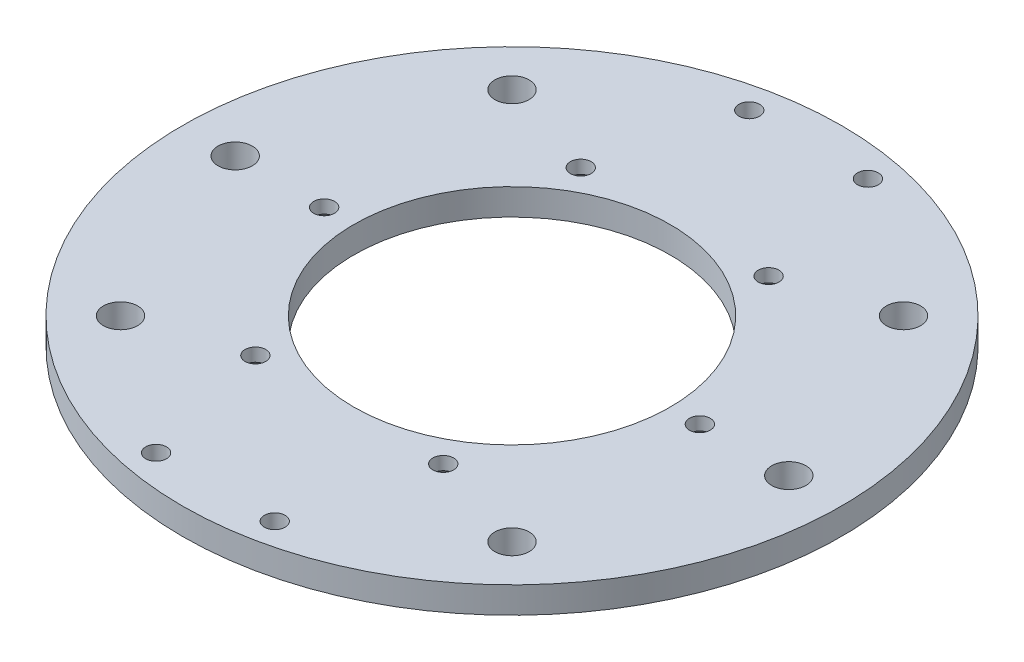
ISO-10303-21;
HEADER;
FILE_DESCRIPTION(('STEP AP214'),'2;1');
FILE_NAME('part.step','',(''),(''),'','','');
FILE_SCHEMA(('AUTOMOTIVE_DESIGN { 1 0 10303 214 1 1 1 1 }'));
ENDSEC;
DATA;
#1=APPLICATION_CONTEXT('core data for automotive mechanical design processes');
#2=APPLICATION_PROTOCOL_DEFINITION('international standard','automotive_design',2000,#1);
#3=PRODUCT_CONTEXT('',#1,'mechanical');
#4=PRODUCT('Part','Part','',(#3));
#5=PRODUCT_RELATED_PRODUCT_CATEGORY('part','',(#4));
#6=PRODUCT_DEFINITION_FORMATION('','',#4);
#7=PRODUCT_DEFINITION_CONTEXT('part definition',#1,'design');
#8=PRODUCT_DEFINITION('design','',#6,#7);
#9=PRODUCT_DEFINITION_SHAPE('','',#8);
#10=(LENGTH_UNIT() NAMED_UNIT(*) SI_UNIT(.MILLI.,.METRE.));
#11=(NAMED_UNIT(*) PLANE_ANGLE_UNIT() SI_UNIT($,.RADIAN.));
#12=(NAMED_UNIT(*) SI_UNIT($,.STERADIAN.) SOLID_ANGLE_UNIT());
#13=UNCERTAINTY_MEASURE_WITH_UNIT(LENGTH_MEASURE(1.E-05),#10,'distance_accuracy_value','');
#14=(GEOMETRIC_REPRESENTATION_CONTEXT(3) GLOBAL_UNCERTAINTY_ASSIGNED_CONTEXT((#13)) GLOBAL_UNIT_ASSIGNED_CONTEXT((#10,
#11,#12)) REPRESENTATION_CONTEXT('',''));
#15=CARTESIAN_POINT('',(0.,0.,0.));
#16=DIRECTION('',(0.,0.,1.));
#17=DIRECTION('',(1.,0.,0.));
#18=AXIS2_PLACEMENT_3D('',#15,#16,#17);
#19=CARTESIAN_POINT('',(0.,4.,0.));
#20=DIRECTION('',(0.,1.,0.));
#21=DIRECTION('',(0.,0.,1.));
#22=AXIS2_PLACEMENT_3D('',#19,#20,#21);
#23=PLANE('',#22);
#24=CARTESIAN_POINT('',(29.6984848098349,4.,-29.6984848098351));
#25=DIRECTION('',(0.,-1.,0.));
#26=DIRECTION('',(0.,0.,-1.));
#27=AXIS2_PLACEMENT_3D('',#24,#25,#26);
#28=CIRCLE('',#27,2.59999999999999);
#29=CARTESIAN_POINT('',(29.6984848098349,4.,-32.298484809835));
#30=VERTEX_POINT('',#29);
#31=EDGE_CURVE('E143',#30,#30,#28,.T.);
#32=ORIENTED_EDGE('',*,*,#31,.T.);
#33=EDGE_LOOP('',(#32));
#34=FACE_BOUND('',#33,.T.);
#35=CARTESIAN_POINT('',(-42.,4.,0.));
#36=DIRECTION('',(0.,-1.,0.));
#37=DIRECTION('',(0.,0.,-1.));
#38=AXIS2_PLACEMENT_3D('',#35,#36,#37);
#39=CIRCLE('',#38,2.59999999999998);
#40=CARTESIAN_POINT('',(-42.,4.,-2.59999999999998));
#41=VERTEX_POINT('',#40);
#42=EDGE_CURVE('E137',#41,#41,#39,.T.);
#43=ORIENTED_EDGE('',*,*,#42,.T.);
#44=EDGE_LOOP('',(#43));
#45=FACE_BOUND('',#44,.T.);
#46=CARTESIAN_POINT('',(42.,4.,0.));
#47=DIRECTION('',(0.,-1.,0.));
#48=DIRECTION('',(0.,0.,-1.));
#49=AXIS2_PLACEMENT_3D('',#46,#47,#48);
#50=CIRCLE('',#49,2.59999999999998);
#51=CARTESIAN_POINT('',(42.,4.,-2.59999999999998));
#52=VERTEX_POINT('',#51);
#53=EDGE_CURVE('E131',#52,#52,#50,.T.);
#54=ORIENTED_EDGE('',*,*,#53,.T.);
#55=EDGE_LOOP('',(#54));
#56=FACE_BOUND('',#55,.T.);
#57=CARTESIAN_POINT('',(-9.00000000000001,4.,-45.));
#58=DIRECTION('',(0.,-1.,0.));
#59=DIRECTION('',(0.,0.,-1.));
#60=AXIS2_PLACEMENT_3D('',#57,#58,#59);
#61=CIRCLE('',#60,1.575);
#62=CARTESIAN_POINT('',(-9.00000000000001,4.,-46.575));
#63=VERTEX_POINT('',#62);
#64=EDGE_CURVE('E125',#63,#63,#61,.T.);
#65=ORIENTED_EDGE('',*,*,#64,.T.);
#66=EDGE_LOOP('',(#65));
#67=FACE_BOUND('',#66,.T.);
#68=CARTESIAN_POINT('',(-9.00000000000001,4.,45.));
#69=DIRECTION('',(0.,-1.,0.));
#70=DIRECTION('',(0.,0.,-1.));
#71=AXIS2_PLACEMENT_3D('',#68,#69,#70);
#72=CIRCLE('',#71,1.575);
#73=CARTESIAN_POINT('',(-9.00000000000001,4.,43.425));
#74=VERTEX_POINT('',#73);
#75=EDGE_CURVE('E119',#74,#74,#72,.T.);
#76=ORIENTED_EDGE('',*,*,#75,.T.);
#77=EDGE_LOOP('',(#76));
#78=FACE_BOUND('',#77,.T.);
#79=CARTESIAN_POINT('',(8.99999999999999,4.,-45.));
#80=DIRECTION('',(0.,-1.,0.));
#81=DIRECTION('',(0.,0.,-1.));
#82=AXIS2_PLACEMENT_3D('',#79,#80,#81);
#83=CIRCLE('',#82,1.575);
#84=CARTESIAN_POINT('',(8.99999999999999,4.,-46.575));
#85=VERTEX_POINT('',#84);
#86=EDGE_CURVE('E113',#85,#85,#83,.T.);
#87=ORIENTED_EDGE('',*,*,#86,.T.);
#88=EDGE_LOOP('',(#87));
#89=FACE_BOUND('',#88,.T.);
#90=CARTESIAN_POINT('',(8.99999999999999,4.,45.));
#91=DIRECTION('',(0.,-1.,0.));
#92=DIRECTION('',(0.,0.,-1.));
#93=AXIS2_PLACEMENT_3D('',#90,#91,#92);
#94=CIRCLE('',#93,1.575);
#95=CARTESIAN_POINT('',(8.99999999999999,4.,43.425));
#96=VERTEX_POINT('',#95);
#97=EDGE_CURVE('E107',#96,#96,#94,.T.);
#98=ORIENTED_EDGE('',*,*,#97,.T.);
#99=EDGE_LOOP('',(#98));
#100=FACE_BOUND('',#99,.T.);
#101=CARTESIAN_POINT('',(14.2500000000003,4.,24.6817240078563));
#102=DIRECTION('',(0.,1.,0.));
#103=DIRECTION('',(0.,0.,1.));
#104=AXIS2_PLACEMENT_3D('',#101,#102,#103);
#105=CIRCLE('',#104,1.57499999999999);
#106=CARTESIAN_POINT('',(14.2500000000003,4.,26.2567240078563));
#107=VERTEX_POINT('',#106);
#108=EDGE_CURVE('E104',#107,#107,#105,.T.);
#109=ORIENTED_EDGE('',*,*,#108,.F.);
#110=EDGE_LOOP('',(#109));
#111=FACE_BOUND('',#110,.T.);
#112=CARTESIAN_POINT('',(-14.2499999999998,4.,24.6817240078566));
#113=DIRECTION('',(0.,1.,0.));
#114=DIRECTION('',(0.,0.,1.));
#115=AXIS2_PLACEMENT_3D('',#112,#113,#114);
#116=CIRCLE('',#115,1.57499999999999);
#117=CARTESIAN_POINT('',(-14.2499999999998,4.,26.2567240078566));
#118=VERTEX_POINT('',#117);
#119=EDGE_CURVE('E101',#118,#118,#116,.T.);
#120=ORIENTED_EDGE('',*,*,#119,.F.);
#121=EDGE_LOOP('',(#120));
#122=FACE_BOUND('',#121,.T.);
#123=CARTESIAN_POINT('',(-28.5,4.,0.));
#124=DIRECTION('',(0.,1.,0.));
#125=DIRECTION('',(0.,0.,1.));
#126=AXIS2_PLACEMENT_3D('',#123,#124,#125);
#127=CIRCLE('',#126,1.57499999999999);
#128=CARTESIAN_POINT('',(-28.5,4.,1.57499999999999));
#129=VERTEX_POINT('',#128);
#130=EDGE_CURVE('E98',#129,#129,#127,.T.);
#131=ORIENTED_EDGE('',*,*,#130,.F.);
#132=EDGE_LOOP('',(#131));
#133=FACE_BOUND('',#132,.T.);
#134=CARTESIAN_POINT('',(-14.2500000000001,4.,-24.6817240078564));
#135=DIRECTION('',(0.,1.,0.));
#136=DIRECTION('',(0.,0.,1.));
#137=AXIS2_PLACEMENT_3D('',#134,#135,#136);
#138=CIRCLE('',#137,1.57499999999999);
#139=CARTESIAN_POINT('',(-14.2500000000001,4.,-23.1067240078564));
#140=VERTEX_POINT('',#139);
#141=EDGE_CURVE('E95',#140,#140,#138,.T.);
#142=ORIENTED_EDGE('',*,*,#141,.F.);
#143=EDGE_LOOP('',(#142));
#144=FACE_BOUND('',#143,.T.);
#145=CARTESIAN_POINT('',(14.2499999999999,4.,-24.6817240078565));
#146=DIRECTION('',(0.,1.,0.));
#147=DIRECTION('',(0.,0.,1.));
#148=AXIS2_PLACEMENT_3D('',#145,#146,#147);
#149=CIRCLE('',#148,1.57499999999999);
#150=CARTESIAN_POINT('',(14.2499999999999,4.,-23.1067240078565));
#151=VERTEX_POINT('',#150);
#152=EDGE_CURVE('E92',#151,#151,#149,.T.);
#153=ORIENTED_EDGE('',*,*,#152,.F.);
#154=EDGE_LOOP('',(#153));
#155=FACE_BOUND('',#154,.T.);
#156=CARTESIAN_POINT('',(28.5,4.,0.));
#157=DIRECTION('',(0.,1.,0.));
#158=DIRECTION('',(0.,0.,1.));
#159=AXIS2_PLACEMENT_3D('',#156,#157,#158);
#160=CIRCLE('',#159,1.57499999999999);
#161=CARTESIAN_POINT('',(28.5,4.,1.57499999999999));
#162=VERTEX_POINT('',#161);
#163=EDGE_CURVE('E87',#162,#162,#160,.T.);
#164=ORIENTED_EDGE('',*,*,#163,.F.);
#165=EDGE_LOOP('',(#164));
#166=FACE_BOUND('',#165,.T.);
#167=CARTESIAN_POINT('',(0.,4.,0.));
#168=DIRECTION('',(0.,1.,0.));
#169=DIRECTION('',(0.,0.,1.));
#170=AXIS2_PLACEMENT_3D('',#167,#168,#169);
#171=CIRCLE('',#170,50.);
#172=CARTESIAN_POINT('',(0.,4.,50.));
#173=VERTEX_POINT('',#172);
#174=EDGE_CURVE('E77',#173,#173,#171,.T.);
#175=ORIENTED_EDGE('',*,*,#174,.T.);
#176=EDGE_LOOP('',(#175));
#177=FACE_BOUND('',#176,.T.);
#178=CARTESIAN_POINT('',(0.,4.,0.));
#179=DIRECTION('',(0.,1.,0.));
#180=DIRECTION('',(0.,0.,1.));
#181=AXIS2_PLACEMENT_3D('',#178,#179,#180);
#182=CIRCLE('',#181,24.);
#183=CARTESIAN_POINT('',(0.,4.,24.));
#184=VERTEX_POINT('',#183);
#185=EDGE_CURVE('E81',#184,#184,#182,.T.);
#186=ORIENTED_EDGE('',*,*,#185,.F.);
#187=EDGE_LOOP('',(#186));
#188=FACE_BOUND('',#187,.T.);
#189=CARTESIAN_POINT('',(-29.6984848098349,4.,29.6984848098351));
#190=DIRECTION('',(0.,-1.,0.));
#191=DIRECTION('',(0.,0.,-1.));
#192=AXIS2_PLACEMENT_3D('',#189,#190,#191);
#193=CIRCLE('',#192,2.59999999999999);
#194=CARTESIAN_POINT('',(-29.6984848098349,4.,27.0984848098351));
#195=VERTEX_POINT('',#194);
#196=EDGE_CURVE('E149',#195,#195,#193,.T.);
#197=ORIENTED_EDGE('',*,*,#196,.T.);
#198=EDGE_LOOP('',(#197));
#199=FACE_BOUND('',#198,.T.);
#200=CARTESIAN_POINT('',(29.6984848098349,4.,29.6984848098351));
#201=DIRECTION('',(0.,-1.,0.));
#202=DIRECTION('',(0.,0.,-1.));
#203=AXIS2_PLACEMENT_3D('',#200,#201,#202);
#204=CIRCLE('',#203,2.59999999999999);
#205=CARTESIAN_POINT('',(29.6984848098349,4.,27.0984848098351));
#206=VERTEX_POINT('',#205);
#207=EDGE_CURVE('E155',#206,#206,#204,.T.);
#208=ORIENTED_EDGE('',*,*,#207,.T.);
#209=EDGE_LOOP('',(#208));
#210=FACE_BOUND('',#209,.T.);
#211=CARTESIAN_POINT('',(-29.6984848098349,4.,-29.6984848098351));
#212=DIRECTION('',(0.,-1.,0.));
#213=DIRECTION('',(0.,0.,-1.));
#214=AXIS2_PLACEMENT_3D('',#211,#212,#213);
#215=CIRCLE('',#214,2.59999999999999);
#216=CARTESIAN_POINT('',(-29.6984848098349,4.,-32.298484809835));
#217=VERTEX_POINT('',#216);
#218=EDGE_CURVE('E161',#217,#217,#215,.T.);
#219=ORIENTED_EDGE('',*,*,#218,.T.);
#220=EDGE_LOOP('',(#219));
#221=FACE_BOUND('',#220,.T.);
#222=ADVANCED_FACE('F33',(#34,#45,#56,#67,#78,#89,#100,#111,#122,#133,#144,#155,#166,#177,#188,
#199,#210,#221),#23,.T.);
#223=CARTESIAN_POINT('',(0.,0.,0.));
#224=DIRECTION('',(0.,1.,0.));
#225=DIRECTION('',(0.,0.,1.));
#226=AXIS2_PLACEMENT_3D('',#223,#224,#225);
#227=PLANE('',#226);
#228=CARTESIAN_POINT('',(-29.6984848098349,0.,-29.6984848098351));
#229=DIRECTION('',(0.,-1.,0.));
#230=DIRECTION('',(0.,0.,-1.));
#231=AXIS2_PLACEMENT_3D('',#228,#229,#230);
#232=CIRCLE('',#231,2.59999999999999);
#233=CARTESIAN_POINT('',(-29.6984848098349,0.,-32.298484809835));
#234=VERTEX_POINT('',#233);
#235=EDGE_CURVE('E164',#234,#234,#232,.T.);
#236=ORIENTED_EDGE('',*,*,#235,.F.);
#237=EDGE_LOOP('',(#236));
#238=FACE_BOUND('',#237,.T.);
#239=CARTESIAN_POINT('',(-29.6984848098349,0.,29.6984848098351));
#240=DIRECTION('',(0.,-1.,0.));
#241=DIRECTION('',(0.,0.,-1.));
#242=AXIS2_PLACEMENT_3D('',#239,#240,#241);
#243=CIRCLE('',#242,2.59999999999999);
#244=CARTESIAN_POINT('',(-29.6984848098349,0.,27.0984848098351));
#245=VERTEX_POINT('',#244);
#246=EDGE_CURVE('E152',#245,#245,#243,.T.);
#247=ORIENTED_EDGE('',*,*,#246,.F.);
#248=EDGE_LOOP('',(#247));
#249=FACE_BOUND('',#248,.T.);
#250=CARTESIAN_POINT('',(-42.,0.,0.));
#251=DIRECTION('',(0.,-1.,0.));
#252=DIRECTION('',(0.,0.,-1.));
#253=AXIS2_PLACEMENT_3D('',#250,#251,#252);
#254=CIRCLE('',#253,2.59999999999998);
#255=CARTESIAN_POINT('',(-42.,0.,-2.59999999999998));
#256=VERTEX_POINT('',#255);
#257=EDGE_CURVE('E140',#256,#256,#254,.T.);
#258=ORIENTED_EDGE('',*,*,#257,.F.);
#259=EDGE_LOOP('',(#258));
#260=FACE_BOUND('',#259,.T.);
#261=CARTESIAN_POINT('',(42.,0.,0.));
#262=DIRECTION('',(0.,-1.,0.));
#263=DIRECTION('',(0.,0.,-1.));
#264=AXIS2_PLACEMENT_3D('',#261,#262,#263);
#265=CIRCLE('',#264,2.59999999999998);
#266=CARTESIAN_POINT('',(42.,0.,-2.59999999999998));
#267=VERTEX_POINT('',#266);
#268=EDGE_CURVE('E134',#267,#267,#265,.T.);
#269=ORIENTED_EDGE('',*,*,#268,.F.);
#270=EDGE_LOOP('',(#269));
#271=FACE_BOUND('',#270,.T.);
#272=CARTESIAN_POINT('',(-9.00000000000001,0.,-45.));
#273=DIRECTION('',(0.,-1.,0.));
#274=DIRECTION('',(0.,0.,-1.));
#275=AXIS2_PLACEMENT_3D('',#272,#273,#274);
#276=CIRCLE('',#275,1.57499999999999);
#277=CARTESIAN_POINT('',(-9.00000000000001,0.,-46.575));
#278=VERTEX_POINT('',#277);
#279=EDGE_CURVE('E128',#278,#278,#276,.T.);
#280=ORIENTED_EDGE('',*,*,#279,.F.);
#281=EDGE_LOOP('',(#280));
#282=FACE_BOUND('',#281,.T.);
#283=CARTESIAN_POINT('',(-9.00000000000001,0.,45.));
#284=DIRECTION('',(0.,-1.,0.));
#285=DIRECTION('',(0.,0.,-1.));
#286=AXIS2_PLACEMENT_3D('',#283,#284,#285);
#287=CIRCLE('',#286,1.57499999999999);
#288=CARTESIAN_POINT('',(-9.00000000000001,0.,43.425));
#289=VERTEX_POINT('',#288);
#290=EDGE_CURVE('E122',#289,#289,#287,.T.);
#291=ORIENTED_EDGE('',*,*,#290,.F.);
#292=EDGE_LOOP('',(#291));
#293=FACE_BOUND('',#292,.T.);
#294=CARTESIAN_POINT('',(8.99999999999999,0.,-45.));
#295=DIRECTION('',(0.,-1.,0.));
#296=DIRECTION('',(0.,0.,-1.));
#297=AXIS2_PLACEMENT_3D('',#294,#295,#296);
#298=CIRCLE('',#297,1.57499999999999);
#299=CARTESIAN_POINT('',(8.99999999999999,0.,-46.575));
#300=VERTEX_POINT('',#299);
#301=EDGE_CURVE('E116',#300,#300,#298,.T.);
#302=ORIENTED_EDGE('',*,*,#301,.F.);
#303=EDGE_LOOP('',(#302));
#304=FACE_BOUND('',#303,.T.);
#305=CARTESIAN_POINT('',(8.99999999999999,0.,45.));
#306=DIRECTION('',(0.,-1.,0.));
#307=DIRECTION('',(0.,0.,-1.));
#308=AXIS2_PLACEMENT_3D('',#305,#306,#307);
#309=CIRCLE('',#308,1.57499999999999);
#310=CARTESIAN_POINT('',(8.99999999999999,0.,43.425));
#311=VERTEX_POINT('',#310);
#312=EDGE_CURVE('E110',#311,#311,#309,.T.);
#313=ORIENTED_EDGE('',*,*,#312,.F.);
#314=EDGE_LOOP('',(#313));
#315=FACE_BOUND('',#314,.T.);
#316=CARTESIAN_POINT('',(-14.2499999999998,0.,24.6817240078566));
#317=DIRECTION('',(0.,1.,0.));
#318=DIRECTION('',(0.,0.,1.));
#319=AXIS2_PLACEMENT_3D('',#316,#317,#318);
#320=CIRCLE('',#319,3.57499999999998);
#321=CARTESIAN_POINT('',(-14.2499999999998,0.,28.2567240078566));
#322=VERTEX_POINT('',#321);
#323=EDGE_CURVE('E59',#322,#322,#320,.T.);
#324=ORIENTED_EDGE('',*,*,#323,.T.);
#325=EDGE_LOOP('',(#324));
#326=FACE_BOUND('',#325,.T.);
#327=CARTESIAN_POINT('',(-28.5,0.,0.));
#328=DIRECTION('',(0.,1.,0.));
#329=DIRECTION('',(0.,0.,1.));
#330=AXIS2_PLACEMENT_3D('',#327,#328,#329);
#331=CIRCLE('',#330,3.57499999999998);
#332=CARTESIAN_POINT('',(-28.5,0.,3.57499999999998));
#333=VERTEX_POINT('',#332);
#334=EDGE_CURVE('E62',#333,#333,#331,.T.);
#335=ORIENTED_EDGE('',*,*,#334,.T.);
#336=EDGE_LOOP('',(#335));
#337=FACE_BOUND('',#336,.T.);
#338=CARTESIAN_POINT('',(-14.2500000000001,0.,-24.6817240078564));
#339=DIRECTION('',(0.,1.,0.));
#340=DIRECTION('',(0.,0.,1.));
#341=AXIS2_PLACEMENT_3D('',#338,#339,#340);
#342=CIRCLE('',#341,3.57499999999998);
#343=CARTESIAN_POINT('',(-14.2500000000001,0.,-21.1067240078565));
#344=VERTEX_POINT('',#343);
#345=EDGE_CURVE('E65',#344,#344,#342,.T.);
#346=ORIENTED_EDGE('',*,*,#345,.T.);
#347=EDGE_LOOP('',(#346));
#348=FACE_BOUND('',#347,.T.);
#349=CARTESIAN_POINT('',(14.2499999999999,0.,-24.6817240078565));
#350=DIRECTION('',(0.,1.,0.));
#351=DIRECTION('',(0.,0.,1.));
#352=AXIS2_PLACEMENT_3D('',#349,#350,#351);
#353=CIRCLE('',#352,3.57499999999998);
#354=CARTESIAN_POINT('',(14.2499999999999,0.,-21.1067240078566));
#355=VERTEX_POINT('',#354);
#356=EDGE_CURVE('E68',#355,#355,#353,.T.);
#357=ORIENTED_EDGE('',*,*,#356,.T.);
#358=EDGE_LOOP('',(#357));
#359=FACE_BOUND('',#358,.T.);
#360=CARTESIAN_POINT('',(28.5,0.,0.));
#361=DIRECTION('',(0.,1.,0.));
#362=DIRECTION('',(0.,0.,1.));
#363=AXIS2_PLACEMENT_3D('',#360,#361,#362);
#364=CIRCLE('',#363,3.57499999999998);
#365=CARTESIAN_POINT('',(28.5,0.,3.57499999999998));
#366=VERTEX_POINT('',#365);
#367=EDGE_CURVE('E71',#366,#366,#364,.T.);
#368=ORIENTED_EDGE('',*,*,#367,.T.);
#369=EDGE_LOOP('',(#368));
#370=FACE_BOUND('',#369,.T.);
#371=CARTESIAN_POINT('',(14.2500000000003,0.,24.6817240078563));
#372=DIRECTION('',(0.,1.,0.));
#373=DIRECTION('',(0.,0.,1.));
#374=AXIS2_PLACEMENT_3D('',#371,#372,#373);
#375=CIRCLE('',#374,3.57499999999998);
#376=CARTESIAN_POINT('',(14.2500000000003,0.,28.2567240078563));
#377=VERTEX_POINT('',#376);
#378=EDGE_CURVE('E74',#377,#377,#375,.T.);
#379=ORIENTED_EDGE('',*,*,#378,.T.);
#380=EDGE_LOOP('',(#379));
#381=FACE_BOUND('',#380,.T.);
#382=CARTESIAN_POINT('',(0.,0.,0.));
#383=DIRECTION('',(0.,1.,0.));
#384=DIRECTION('',(0.,0.,1.));
#385=AXIS2_PLACEMENT_3D('',#382,#383,#384);
#386=CIRCLE('',#385,50.);
#387=CARTESIAN_POINT('',(0.,0.,50.));
#388=VERTEX_POINT('',#387);
#389=EDGE_CURVE('E78',#388,#388,#386,.T.);
#390=ORIENTED_EDGE('',*,*,#389,.F.);
#391=EDGE_LOOP('',(#390));
#392=FACE_BOUND('',#391,.T.);
#393=CARTESIAN_POINT('',(0.,0.,0.));
#394=DIRECTION('',(0.,1.,0.));
#395=DIRECTION('',(0.,0.,1.));
#396=AXIS2_PLACEMENT_3D('',#393,#394,#395);
#397=CIRCLE('',#396,24.);
#398=CARTESIAN_POINT('',(0.,0.,24.));
#399=VERTEX_POINT('',#398);
#400=EDGE_CURVE('E84',#399,#399,#397,.T.);
#401=ORIENTED_EDGE('',*,*,#400,.T.);
#402=EDGE_LOOP('',(#401));
#403=FACE_BOUND('',#402,.T.);
#404=CARTESIAN_POINT('',(29.6984848098349,0.,-29.6984848098351));
#405=DIRECTION('',(0.,-1.,0.));
#406=DIRECTION('',(0.,0.,-1.));
#407=AXIS2_PLACEMENT_3D('',#404,#405,#406);
#408=CIRCLE('',#407,2.59999999999999);
#409=CARTESIAN_POINT('',(29.6984848098349,0.,-32.298484809835));
#410=VERTEX_POINT('',#409);
#411=EDGE_CURVE('E146',#410,#410,#408,.T.);
#412=ORIENTED_EDGE('',*,*,#411,.F.);
#413=EDGE_LOOP('',(#412));
#414=FACE_BOUND('',#413,.T.);
#415=CARTESIAN_POINT('',(29.6984848098349,0.,29.6984848098351));
#416=DIRECTION('',(0.,-1.,0.));
#417=DIRECTION('',(0.,0.,-1.));
#418=AXIS2_PLACEMENT_3D('',#415,#416,#417);
#419=CIRCLE('',#418,2.59999999999999);
#420=CARTESIAN_POINT('',(29.6984848098349,0.,27.0984848098351));
#421=VERTEX_POINT('',#420);
#422=EDGE_CURVE('E158',#421,#421,#419,.T.);
#423=ORIENTED_EDGE('',*,*,#422,.F.);
#424=EDGE_LOOP('',(#423));
#425=FACE_BOUND('',#424,.T.);
#426=ADVANCED_FACE('F170',(#238,#249,#260,#271,#282,#293,#304,#315,#326,#337,#348,#359,#370,
#381,#392,#403,#414,#425),#227,.F.);
#427=CARTESIAN_POINT('',(0.,4.,0.));
#428=DIRECTION('',(0.,-1.,0.));
#429=DIRECTION('',(0.,0.,-1.));
#430=AXIS2_PLACEMENT_3D('',#427,#428,#429);
#431=CYLINDRICAL_SURFACE('',#430,50.);
#432=ORIENTED_EDGE('',*,*,#174,.F.);
#433=EDGE_LOOP('',(#432));
#434=FACE_BOUND('',#433,.T.);
#435=ORIENTED_EDGE('',*,*,#389,.T.);
#436=EDGE_LOOP('',(#435));
#437=FACE_BOUND('',#436,.T.);
#438=ADVANCED_FACE('F173',(#434,#437),#431,.T.);
#439=CARTESIAN_POINT('',(0.,4.,0.));
#440=DIRECTION('',(0.,-1.,0.));
#441=DIRECTION('',(0.,0.,-1.));
#442=AXIS2_PLACEMENT_3D('',#439,#440,#441);
#443=CYLINDRICAL_SURFACE('',#442,24.);
#444=ORIENTED_EDGE('',*,*,#185,.T.);
#445=EDGE_LOOP('',(#444));
#446=FACE_BOUND('',#445,.T.);
#447=ORIENTED_EDGE('',*,*,#400,.F.);
#448=EDGE_LOOP('',(#447));
#449=FACE_BOUND('',#448,.T.);
#450=ADVANCED_FACE('F232',(#446,#449),#443,.F.);
#451=CARTESIAN_POINT('',(28.5,4.,0.));
#452=DIRECTION('',(0.,1.,0.));
#453=DIRECTION('',(0.,0.,1.));
#454=AXIS2_PLACEMENT_3D('',#451,#452,#453);
#455=CYLINDRICAL_SURFACE('',#454,1.57499999999999);
#456=CARTESIAN_POINT('',(28.5,2.00000000000001,0.));
#457=DIRECTION('',(0.,1.,0.));
#458=DIRECTION('',(0.,0.,1.));
#459=AXIS2_PLACEMENT_3D('',#456,#457,#458);
#460=CIRCLE('',#459,1.57499999999999);
#461=CARTESIAN_POINT('',(28.5,2.00000000000001,1.57499999999999));
#462=VERTEX_POINT('',#461);
#463=EDGE_CURVE('E40',#462,#462,#460,.F.);
#464=ORIENTED_EDGE('',*,*,#463,.T.);
#465=EDGE_LOOP('',(#464));
#466=FACE_BOUND('',#465,.T.);
#467=ORIENTED_EDGE('',*,*,#163,.T.);
#468=EDGE_LOOP('',(#467));
#469=FACE_BOUND('',#468,.T.);
#470=ADVANCED_FACE('F297',(#466,#469),#455,.F.);
#471=CARTESIAN_POINT('',(14.2499999999999,4.,-24.6817240078565));
#472=DIRECTION('',(0.,1.,0.));
#473=DIRECTION('',(0.,0.,1.));
#474=AXIS2_PLACEMENT_3D('',#471,#472,#473);
#475=CYLINDRICAL_SURFACE('',#474,1.57499999999999);
#476=CARTESIAN_POINT('',(14.2499999999999,2.00000000000002,-24.6817240078565));
#477=DIRECTION('',(0.,1.,0.));
#478=DIRECTION('',(0.,0.,1.));
#479=AXIS2_PLACEMENT_3D('',#476,#477,#478);
#480=CIRCLE('',#479,1.57499999999999);
#481=CARTESIAN_POINT('',(14.2499999999999,2.00000000000002,-23.1067240078566));
#482=VERTEX_POINT('',#481);
#483=EDGE_CURVE('E44',#482,#482,#480,.F.);
#484=ORIENTED_EDGE('',*,*,#483,.T.);
#485=EDGE_LOOP('',(#484));
#486=FACE_BOUND('',#485,.T.);
#487=ORIENTED_EDGE('',*,*,#152,.T.);
#488=EDGE_LOOP('',(#487));
#489=FACE_BOUND('',#488,.T.);
#490=ADVANCED_FACE('F294',(#486,#489),#475,.F.);
#491=CARTESIAN_POINT('',(-14.2500000000001,4.,-24.6817240078564));
#492=DIRECTION('',(0.,1.,0.));
#493=DIRECTION('',(0.,0.,1.));
#494=AXIS2_PLACEMENT_3D('',#491,#492,#493);
#495=CYLINDRICAL_SURFACE('',#494,1.57499999999999);
#496=CARTESIAN_POINT('',(-14.2500000000001,2.00000000000001,-24.6817240078564));
#497=DIRECTION('',(0.,1.,0.));
#498=DIRECTION('',(0.,0.,1.));
#499=AXIS2_PLACEMENT_3D('',#496,#497,#498);
#500=CIRCLE('',#499,1.57499999999999);
#501=CARTESIAN_POINT('',(-14.2500000000001,2.00000000000001,-23.1067240078564));
#502=VERTEX_POINT('',#501);
#503=EDGE_CURVE('E48',#502,#502,#500,.F.);
#504=ORIENTED_EDGE('',*,*,#503,.T.);
#505=EDGE_LOOP('',(#504));
#506=FACE_BOUND('',#505,.T.);
#507=ORIENTED_EDGE('',*,*,#141,.T.);
#508=EDGE_LOOP('',(#507));
#509=FACE_BOUND('',#508,.T.);
#510=ADVANCED_FACE('F290',(#506,#509),#495,.F.);
#511=CARTESIAN_POINT('',(-28.5,4.,0.));
#512=DIRECTION('',(0.,1.,0.));
#513=DIRECTION('',(0.,0.,1.));
#514=AXIS2_PLACEMENT_3D('',#511,#512,#513);
#515=CYLINDRICAL_SURFACE('',#514,1.57499999999999);
#516=CARTESIAN_POINT('',(-28.5,2.00000000000001,0.));
#517=DIRECTION('',(0.,1.,0.));
#518=DIRECTION('',(0.,0.,1.));
#519=AXIS2_PLACEMENT_3D('',#516,#517,#518);
#520=CIRCLE('',#519,1.57499999999999);
#521=CARTESIAN_POINT('',(-28.5,2.00000000000001,1.57499999999999));
#522=VERTEX_POINT('',#521);
#523=EDGE_CURVE('E53',#522,#522,#520,.F.);
#524=ORIENTED_EDGE('',*,*,#523,.T.);
#525=EDGE_LOOP('',(#524));
#526=FACE_BOUND('',#525,.T.);
#527=ORIENTED_EDGE('',*,*,#130,.T.);
#528=EDGE_LOOP('',(#527));
#529=FACE_BOUND('',#528,.T.);
#530=ADVANCED_FACE('F286',(#526,#529),#515,.F.);
#531=CARTESIAN_POINT('',(-14.2499999999998,4.,24.6817240078566));
#532=DIRECTION('',(0.,1.,0.));
#533=DIRECTION('',(0.,0.,1.));
#534=AXIS2_PLACEMENT_3D('',#531,#532,#533);
#535=CYLINDRICAL_SURFACE('',#534,1.57499999999999);
#536=CARTESIAN_POINT('',(-14.2499999999998,2.00000000000001,24.6817240078566));
#537=DIRECTION('',(0.,1.,0.));
#538=DIRECTION('',(0.,0.,1.));
#539=AXIS2_PLACEMENT_3D('',#536,#537,#538);
#540=CIRCLE('',#539,1.57499999999999);
#541=CARTESIAN_POINT('',(-14.2499999999998,2.00000000000001,26.2567240078566));
#542=VERTEX_POINT('',#541);
#543=EDGE_CURVE('E56',#542,#542,#540,.F.);
#544=ORIENTED_EDGE('',*,*,#543,.T.);
#545=EDGE_LOOP('',(#544));
#546=FACE_BOUND('',#545,.T.);
#547=ORIENTED_EDGE('',*,*,#119,.T.);
#548=EDGE_LOOP('',(#547));
#549=FACE_BOUND('',#548,.T.);
#550=ADVANCED_FACE('F283',(#546,#549),#535,.F.);
#551=CARTESIAN_POINT('',(14.2500000000003,4.,24.6817240078563));
#552=DIRECTION('',(0.,1.,0.));
#553=DIRECTION('',(0.,0.,1.));
#554=AXIS2_PLACEMENT_3D('',#551,#552,#553);
#555=CYLINDRICAL_SURFACE('',#554,1.57499999999999);
#556=CARTESIAN_POINT('',(14.2500000000003,2.00000000000002,24.6817240078563));
#557=DIRECTION('',(0.,1.,0.));
#558=DIRECTION('',(0.,0.,1.));
#559=AXIS2_PLACEMENT_3D('',#556,#557,#558);
#560=CIRCLE('',#559,1.57499999999999);
#561=CARTESIAN_POINT('',(14.2500000000003,2.00000000000002,26.2567240078563));
#562=VERTEX_POINT('',#561);
#563=EDGE_CURVE('E10',#562,#562,#560,.F.);
#564=ORIENTED_EDGE('',*,*,#563,.T.);
#565=EDGE_LOOP('',(#564));
#566=FACE_BOUND('',#565,.T.);
#567=ORIENTED_EDGE('',*,*,#108,.T.);
#568=EDGE_LOOP('',(#567));
#569=FACE_BOUND('',#568,.T.);
#570=ADVANCED_FACE('F242',(#566,#569),#555,.F.);
#571=CARTESIAN_POINT('',(-14.2499999999998,0.,24.6817240078566));
#572=DIRECTION('',(0.,-1.,0.));
#573=DIRECTION('',(0.,0.,-1.));
#574=AXIS2_PLACEMENT_3D('',#571,#572,#573);
#575=CONICAL_SURFACE('',#574,3.57499999999998,0.785398163397443);
#576=ORIENTED_EDGE('',*,*,#543,.F.);
#577=EDGE_LOOP('',(#576));
#578=FACE_BOUND('',#577,.T.);
#579=ORIENTED_EDGE('',*,*,#323,.F.);
#580=EDGE_LOOP('',(#579));
#581=FACE_BOUND('',#580,.T.);
#582=ADVANCED_FACE('F238',(#578,#581),#575,.F.);
#583=CARTESIAN_POINT('',(-28.5,0.,0.));
#584=DIRECTION('',(0.,-1.,0.));
#585=DIRECTION('',(0.,0.,-1.));
#586=AXIS2_PLACEMENT_3D('',#583,#584,#585);
#587=CONICAL_SURFACE('',#586,3.57499999999998,0.785398163397443);
#588=ORIENTED_EDGE('',*,*,#523,.F.);
#589=EDGE_LOOP('',(#588));
#590=FACE_BOUND('',#589,.T.);
#591=ORIENTED_EDGE('',*,*,#334,.F.);
#592=EDGE_LOOP('',(#591));
#593=FACE_BOUND('',#592,.T.);
#594=ADVANCED_FACE('F241',(#590,#593),#587,.F.);
#595=CARTESIAN_POINT('',(-14.2500000000001,0.,-24.6817240078564));
#596=DIRECTION('',(0.,-1.,0.));
#597=DIRECTION('',(0.,0.,-1.));
#598=AXIS2_PLACEMENT_3D('',#595,#596,#597);
#599=CONICAL_SURFACE('',#598,3.57499999999998,0.785398163397443);
#600=ORIENTED_EDGE('',*,*,#503,.F.);
#601=EDGE_LOOP('',(#600));
#602=FACE_BOUND('',#601,.T.);
#603=ORIENTED_EDGE('',*,*,#345,.F.);
#604=EDGE_LOOP('',(#603));
#605=FACE_BOUND('',#604,.T.);
#606=ADVANCED_FACE('F246',(#602,#605),#599,.F.);
#607=CARTESIAN_POINT('',(14.2499999999999,0.,-24.6817240078565));
#608=DIRECTION('',(0.,-1.,0.));
#609=DIRECTION('',(0.,0.,-1.));
#610=AXIS2_PLACEMENT_3D('',#607,#608,#609);
#611=CONICAL_SURFACE('',#610,3.57499999999998,0.785398163397443);
#612=ORIENTED_EDGE('',*,*,#483,.F.);
#613=EDGE_LOOP('',(#612));
#614=FACE_BOUND('',#613,.T.);
#615=ORIENTED_EDGE('',*,*,#356,.F.);
#616=EDGE_LOOP('',(#615));
#617=FACE_BOUND('',#616,.T.);
#618=ADVANCED_FACE('F250',(#614,#617),#611,.F.);
#619=CARTESIAN_POINT('',(28.5,0.,0.));
#620=DIRECTION('',(0.,-1.,0.));
#621=DIRECTION('',(0.,0.,-1.));
#622=AXIS2_PLACEMENT_3D('',#619,#620,#621);
#623=CONICAL_SURFACE('',#622,3.57499999999998,0.785398163397443);
#624=ORIENTED_EDGE('',*,*,#463,.F.);
#625=EDGE_LOOP('',(#624));
#626=FACE_BOUND('',#625,.T.);
#627=ORIENTED_EDGE('',*,*,#367,.F.);
#628=EDGE_LOOP('',(#627));
#629=FACE_BOUND('',#628,.T.);
#630=ADVANCED_FACE('F253',(#626,#629),#623,.F.);
#631=CARTESIAN_POINT('',(14.2500000000003,0.,24.6817240078563));
#632=DIRECTION('',(0.,-1.,0.));
#633=DIRECTION('',(0.,0.,-1.));
#634=AXIS2_PLACEMENT_3D('',#631,#632,#633);
#635=CONICAL_SURFACE('',#634,3.57499999999998,0.785398163397443);
#636=ORIENTED_EDGE('',*,*,#563,.F.);
#637=EDGE_LOOP('',(#636));
#638=FACE_BOUND('',#637,.T.);
#639=ORIENTED_EDGE('',*,*,#378,.F.);
#640=EDGE_LOOP('',(#639));
#641=FACE_BOUND('',#640,.T.);
#642=ADVANCED_FACE('F35',(#638,#641),#635,.F.);
#643=CARTESIAN_POINT('',(8.99999999999999,0.,45.));
#644=DIRECTION('',(0.,-1.,0.));
#645=DIRECTION('',(0.,0.,-1.));
#646=AXIS2_PLACEMENT_3D('',#643,#644,#645);
#647=CYLINDRICAL_SURFACE('',#646,1.57499999999999);
#648=ORIENTED_EDGE('',*,*,#97,.F.);
#649=EDGE_LOOP('',(#648));
#650=FACE_BOUND('',#649,.T.);
#651=ORIENTED_EDGE('',*,*,#312,.T.);
#652=EDGE_LOOP('',(#651));
#653=FACE_BOUND('',#652,.T.);
#654=ADVANCED_FACE('F260',(#650,#653),#647,.F.);
#655=CARTESIAN_POINT('',(8.99999999999999,0.,-45.));
#656=DIRECTION('',(0.,-1.,0.));
#657=DIRECTION('',(0.,0.,-1.));
#658=AXIS2_PLACEMENT_3D('',#655,#656,#657);
#659=CYLINDRICAL_SURFACE('',#658,1.57499999999999);
#660=ORIENTED_EDGE('',*,*,#86,.F.);
#661=EDGE_LOOP('',(#660));
#662=FACE_BOUND('',#661,.T.);
#663=ORIENTED_EDGE('',*,*,#301,.T.);
#664=EDGE_LOOP('',(#663));
#665=FACE_BOUND('',#664,.T.);
#666=ADVANCED_FACE('F267',(#662,#665),#659,.F.);
#667=CARTESIAN_POINT('',(-9.00000000000001,0.,45.));
#668=DIRECTION('',(0.,-1.,0.));
#669=DIRECTION('',(0.,0.,-1.));
#670=AXIS2_PLACEMENT_3D('',#667,#668,#669);
#671=CYLINDRICAL_SURFACE('',#670,1.57499999999999);
#672=ORIENTED_EDGE('',*,*,#75,.F.);
#673=EDGE_LOOP('',(#672));
#674=FACE_BOUND('',#673,.T.);
#675=ORIENTED_EDGE('',*,*,#290,.T.);
#676=EDGE_LOOP('',(#675));
#677=FACE_BOUND('',#676,.T.);
#678=ADVANCED_FACE('F274',(#674,#677),#671,.F.);
#679=CARTESIAN_POINT('',(-9.00000000000001,0.,-45.));
#680=DIRECTION('',(0.,-1.,0.));
#681=DIRECTION('',(0.,0.,-1.));
#682=AXIS2_PLACEMENT_3D('',#679,#680,#681);
#683=CYLINDRICAL_SURFACE('',#682,1.57499999999999);
#684=ORIENTED_EDGE('',*,*,#64,.F.);
#685=EDGE_LOOP('',(#684));
#686=FACE_BOUND('',#685,.T.);
#687=ORIENTED_EDGE('',*,*,#279,.T.);
#688=EDGE_LOOP('',(#687));
#689=FACE_BOUND('',#688,.T.);
#690=ADVANCED_FACE('F400',(#686,#689),#683,.F.);
#691=CARTESIAN_POINT('',(42.,0.,0.));
#692=DIRECTION('',(0.,-1.,0.));
#693=DIRECTION('',(0.,0.,-1.));
#694=AXIS2_PLACEMENT_3D('',#691,#692,#693);
#695=CYLINDRICAL_SURFACE('',#694,2.59999999999998);
#696=ORIENTED_EDGE('',*,*,#53,.F.);
#697=EDGE_LOOP('',(#696));
#698=FACE_BOUND('',#697,.T.);
#699=ORIENTED_EDGE('',*,*,#268,.T.);
#700=EDGE_LOOP('',(#699));
#701=FACE_BOUND('',#700,.T.);
#702=ADVANCED_FACE('F409',(#698,#701),#695,.F.);
#703=CARTESIAN_POINT('',(-42.,0.,0.));
#704=DIRECTION('',(0.,-1.,0.));
#705=DIRECTION('',(0.,0.,-1.));
#706=AXIS2_PLACEMENT_3D('',#703,#704,#705);
#707=CYLINDRICAL_SURFACE('',#706,2.59999999999998);
#708=ORIENTED_EDGE('',*,*,#42,.F.);
#709=EDGE_LOOP('',(#708));
#710=FACE_BOUND('',#709,.T.);
#711=ORIENTED_EDGE('',*,*,#257,.T.);
#712=EDGE_LOOP('',(#711));
#713=FACE_BOUND('',#712,.T.);
#714=ADVANCED_FACE('F418',(#710,#713),#707,.F.);
#715=CARTESIAN_POINT('',(29.6984848098349,0.,-29.6984848098351));
#716=DIRECTION('',(0.,-1.,0.));
#717=DIRECTION('',(0.,0.,-1.));
#718=AXIS2_PLACEMENT_3D('',#715,#716,#717);
#719=CYLINDRICAL_SURFACE('',#718,2.59999999999999);
#720=ORIENTED_EDGE('',*,*,#31,.F.);
#721=EDGE_LOOP('',(#720));
#722=FACE_BOUND('',#721,.T.);
#723=ORIENTED_EDGE('',*,*,#411,.T.);
#724=EDGE_LOOP('',(#723));
#725=FACE_BOUND('',#724,.T.);
#726=ADVANCED_FACE('F220',(#722,#725),#719,.F.);
#727=CARTESIAN_POINT('',(-29.6984848098349,0.,29.6984848098351));
#728=DIRECTION('',(0.,-1.,0.));
#729=DIRECTION('',(0.,0.,-1.));
#730=AXIS2_PLACEMENT_3D('',#727,#728,#729);
#731=CYLINDRICAL_SURFACE('',#730,2.59999999999999);
#732=ORIENTED_EDGE('',*,*,#196,.F.);
#733=EDGE_LOOP('',(#732));
#734=FACE_BOUND('',#733,.T.);
#735=ORIENTED_EDGE('',*,*,#246,.T.);
#736=EDGE_LOOP('',(#735));
#737=FACE_BOUND('',#736,.T.);
#738=ADVANCED_FACE('F211',(#734,#737),#731,.F.);
#739=CARTESIAN_POINT('',(29.6984848098349,0.,29.6984848098351));
#740=DIRECTION('',(0.,-1.,0.));
#741=DIRECTION('',(0.,0.,-1.));
#742=AXIS2_PLACEMENT_3D('',#739,#740,#741);
#743=CYLINDRICAL_SURFACE('',#742,2.59999999999999);
#744=ORIENTED_EDGE('',*,*,#207,.F.);
#745=EDGE_LOOP('',(#744));
#746=FACE_BOUND('',#745,.T.);
#747=ORIENTED_EDGE('',*,*,#422,.T.);
#748=EDGE_LOOP('',(#747));
#749=FACE_BOUND('',#748,.T.);
#750=ADVANCED_FACE('F209',(#746,#749),#743,.F.);
#751=CARTESIAN_POINT('',(-29.6984848098349,0.,-29.6984848098351));
#752=DIRECTION('',(0.,-1.,0.));
#753=DIRECTION('',(0.,0.,-1.));
#754=AXIS2_PLACEMENT_3D('',#751,#752,#753);
#755=CYLINDRICAL_SURFACE('',#754,2.59999999999999);
#756=ORIENTED_EDGE('',*,*,#218,.F.);
#757=EDGE_LOOP('',(#756));
#758=FACE_BOUND('',#757,.T.);
#759=ORIENTED_EDGE('',*,*,#235,.T.);
#760=EDGE_LOOP('',(#759));
#761=FACE_BOUND('',#760,.T.);
#762=ADVANCED_FACE('F168',(#758,#761),#755,.F.);
#763=CLOSED_SHELL('',(#222,#426,#438,#450,#470,#490,#510,#530,#550,#570,#582,#594,#606,#618,
#630,#642,#654,#666,#678,#690,#702,#714,#726,#738,#750,#762));
#764=MANIFOLD_SOLID_BREP('B2',#763);
#765=ADVANCED_BREP_SHAPE_REPRESENTATION('',(#18,#764),#14);
#766=SHAPE_DEFINITION_REPRESENTATION(#9,#765);
ENDSEC;
END-ISO-10303-21;
